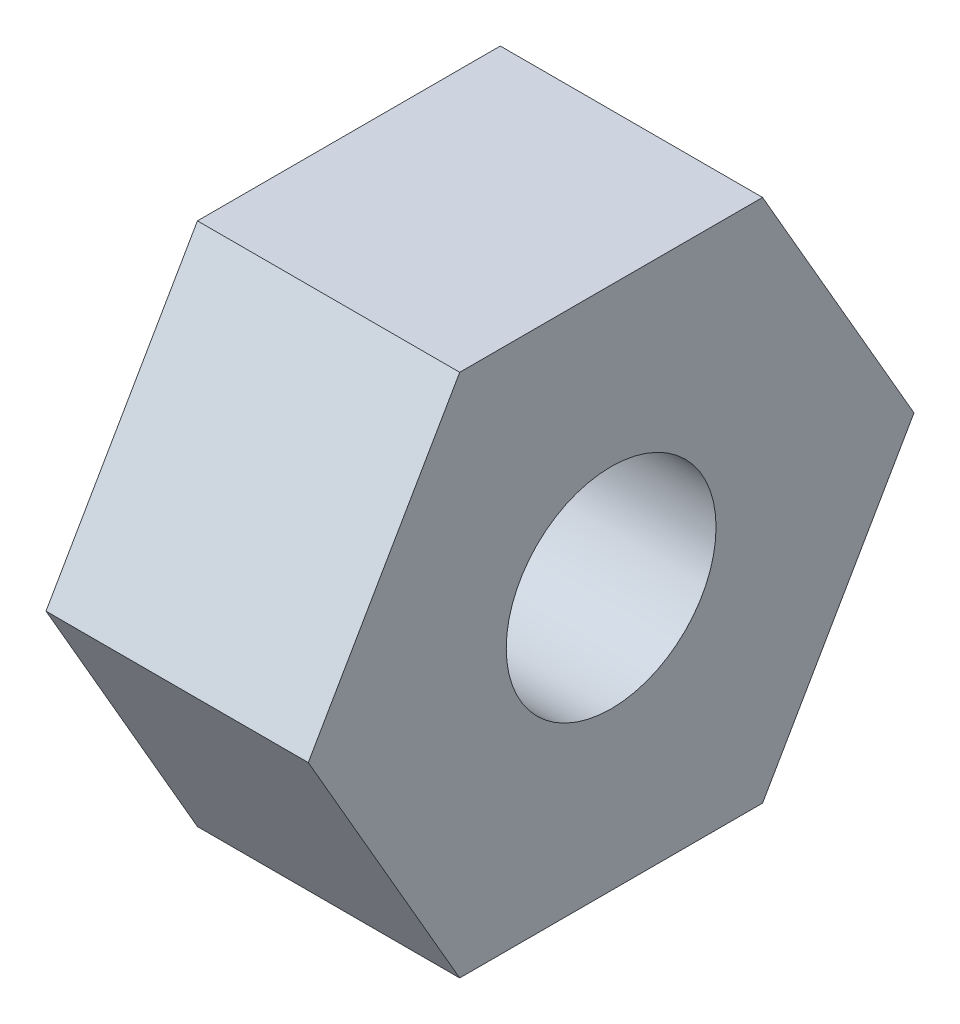
ISO-10303-21;
HEADER;
FILE_DESCRIPTION(('STEP AP214'),'2;1');
FILE_NAME('part.step','',(''),(''),'','','');
FILE_SCHEMA(('AUTOMOTIVE_DESIGN { 1 0 10303 214 1 1 1 1 }'));
ENDSEC;
DATA;
#1=APPLICATION_CONTEXT('core data for automotive mechanical design processes');
#2=APPLICATION_PROTOCOL_DEFINITION('international standard','automotive_design',2000,#1);
#3=PRODUCT_CONTEXT('',#1,'mechanical');
#4=PRODUCT('Part','Part','',(#3));
#5=PRODUCT_RELATED_PRODUCT_CATEGORY('part','',(#4));
#6=PRODUCT_DEFINITION_FORMATION('','',#4);
#7=PRODUCT_DEFINITION_CONTEXT('part definition',#1,'design');
#8=PRODUCT_DEFINITION('design','',#6,#7);
#9=PRODUCT_DEFINITION_SHAPE('','',#8);
#10=(LENGTH_UNIT() NAMED_UNIT(*) SI_UNIT(.MILLI.,.METRE.));
#11=(NAMED_UNIT(*) PLANE_ANGLE_UNIT() SI_UNIT($,.RADIAN.));
#12=(NAMED_UNIT(*) SI_UNIT($,.STERADIAN.) SOLID_ANGLE_UNIT());
#13=UNCERTAINTY_MEASURE_WITH_UNIT(LENGTH_MEASURE(1.E-05),#10,'distance_accuracy_value','');
#14=(GEOMETRIC_REPRESENTATION_CONTEXT(3) GLOBAL_UNCERTAINTY_ASSIGNED_CONTEXT((#13)) GLOBAL_UNIT_ASSIGNED_CONTEXT((#10,
#11,#12)) REPRESENTATION_CONTEXT('',''));
#15=CARTESIAN_POINT('',(0.,0.,0.));
#16=DIRECTION('',(0.,0.,1.));
#17=DIRECTION('',(1.,0.,0.));
#18=AXIS2_PLACEMENT_3D('',#15,#16,#17);
#19=CARTESIAN_POINT('',(5.,-4.99999999999995,-2.88675134594818));
#20=DIRECTION('',(0.,0.499999999999995,0.866025403784442));
#21=DIRECTION('',(0.,-0.866025403784442,0.499999999999995));
#22=AXIS2_PLACEMENT_3D('',#19,#20,#21);
#23=PLANE('',#22);
#24=DIRECTION('',(0.,0.866025403784442,-0.499999999999995));
#25=VECTOR('',#24,1.);
#26=CARTESIAN_POINT('',(0.,-4.99999999999995,-2.88675134594818));
#27=LINE('',#26,#25);
#28=CARTESIAN_POINT('',(0.,-4.99999999999995,-2.88675134594818));
#29=VERTEX_POINT('',#28);
#30=CARTESIAN_POINT('',(0.,0.,-5.77350269189624));
#31=VERTEX_POINT('',#30);
#32=EDGE_CURVE('E117',#29,#31,#27,.T.);
#33=ORIENTED_EDGE('',*,*,#32,.T.);
#34=DIRECTION('',(-1.,0.,0.));
#35=VECTOR('',#34,1.);
#36=CARTESIAN_POINT('',(5.,0.,-5.77350269189624));
#37=LINE('',#36,#35);
#38=CARTESIAN_POINT('',(5.,0.,-5.77350269189624));
#39=VERTEX_POINT('',#38);
#40=EDGE_CURVE('E11',#39,#31,#37,.T.);
#41=ORIENTED_EDGE('',*,*,#40,.F.);
#42=DIRECTION('',(0.,0.866025403784442,-0.499999999999995));
#43=VECTOR('',#42,1.);
#44=CARTESIAN_POINT('',(5.,-4.99999999999995,-2.88675134594818));
#45=LINE('',#44,#43);
#46=CARTESIAN_POINT('',(5.,-4.99999999999995,-2.88675134594818));
#47=VERTEX_POINT('',#46);
#48=EDGE_CURVE('E128',#47,#39,#45,.T.);
#49=ORIENTED_EDGE('',*,*,#48,.F.);
#50=DIRECTION('',(-1.,0.,0.));
#51=VECTOR('',#50,1.);
#52=CARTESIAN_POINT('',(5.,-4.99999999999995,-2.88675134594818));
#53=LINE('',#52,#51);
#54=EDGE_CURVE('E113',#47,#29,#53,.T.);
#55=ORIENTED_EDGE('',*,*,#54,.T.);
#56=EDGE_LOOP('',(#33,#41,#49,#55));
#57=FACE_BOUND('',#56,.T.);
#58=ADVANCED_FACE('F33',(#57),#23,.F.);
#59=CARTESIAN_POINT('',(5.,0.,-5.77350269189624));
#60=DIRECTION('',(0.,-0.500000000000001,0.866025403784438));
#61=DIRECTION('',(0.,-0.866025403784438,-0.500000000000001));
#62=AXIS2_PLACEMENT_3D('',#59,#60,#61);
#63=PLANE('',#62);
#64=DIRECTION('',(0.,0.866025403784438,0.500000000000001));
#65=VECTOR('',#64,1.);
#66=CARTESIAN_POINT('',(0.,0.,-5.77350269189624));
#67=LINE('',#66,#65);
#68=CARTESIAN_POINT('',(0.,4.99999999999999,-2.88675134594811));
#69=VERTEX_POINT('',#68);
#70=EDGE_CURVE('E120',#31,#69,#67,.T.);
#71=ORIENTED_EDGE('',*,*,#70,.T.);
#72=DIRECTION('',(-1.,0.,0.));
#73=VECTOR('',#72,1.);
#74=CARTESIAN_POINT('',(5.,4.99999999999999,-2.88675134594811));
#75=LINE('',#74,#73);
#76=CARTESIAN_POINT('',(5.,4.99999999999999,-2.88675134594811));
#77=VERTEX_POINT('',#76);
#78=EDGE_CURVE('E41',#77,#69,#75,.T.);
#79=ORIENTED_EDGE('',*,*,#78,.F.);
#80=DIRECTION('',(0.,0.866025403784438,0.500000000000001));
#81=VECTOR('',#80,1.);
#82=CARTESIAN_POINT('',(5.,0.,-5.77350269189624));
#83=LINE('',#82,#81);
#84=EDGE_CURVE('E86',#39,#77,#83,.T.);
#85=ORIENTED_EDGE('',*,*,#84,.F.);
#86=ORIENTED_EDGE('',*,*,#40,.T.);
#87=EDGE_LOOP('',(#71,#79,#85,#86));
#88=FACE_BOUND('',#87,.T.);
#89=ADVANCED_FACE('F153',(#88),#63,.F.);
#90=CARTESIAN_POINT('',(5.,4.99999999999999,-2.88675134594811));
#91=DIRECTION('',(0.,-1.,0.));
#92=DIRECTION('',(0.,0.,-1.));
#93=AXIS2_PLACEMENT_3D('',#90,#91,#92);
#94=PLANE('',#93);
#95=DIRECTION('',(0.,0.,1.));
#96=VECTOR('',#95,1.);
#97=CARTESIAN_POINT('',(0.,4.99999999999999,-2.88675134594811));
#98=LINE('',#97,#96);
#99=CARTESIAN_POINT('',(0.,4.99999999999997,2.88675134594814));
#100=VERTEX_POINT('',#99);
#101=EDGE_CURVE('E123',#69,#100,#98,.T.);
#102=ORIENTED_EDGE('',*,*,#101,.T.);
#103=DIRECTION('',(-1.,0.,0.));
#104=VECTOR('',#103,1.);
#105=CARTESIAN_POINT('',(5.,4.99999999999997,2.88675134594814));
#106=LINE('',#105,#104);
#107=CARTESIAN_POINT('',(5.,4.99999999999997,2.88675134594814));
#108=VERTEX_POINT('',#107);
#109=EDGE_CURVE('E108',#108,#100,#106,.T.);
#110=ORIENTED_EDGE('',*,*,#109,.F.);
#111=DIRECTION('',(0.,0.,1.));
#112=VECTOR('',#111,1.);
#113=CARTESIAN_POINT('',(5.,4.99999999999999,-2.88675134594811));
#114=LINE('',#113,#112);
#115=EDGE_CURVE('E99',#77,#108,#114,.T.);
#116=ORIENTED_EDGE('',*,*,#115,.F.);
#117=ORIENTED_EDGE('',*,*,#78,.T.);
#118=EDGE_LOOP('',(#102,#110,#116,#117));
#119=FACE_BOUND('',#118,.T.);
#120=ADVANCED_FACE('F134',(#119),#94,.F.);
#121=CARTESIAN_POINT('',(5.,4.99999999999997,2.88675134594814));
#122=DIRECTION('',(0.,-0.499999999999995,-0.866025403784442));
#123=DIRECTION('',(0.,0.866025403784442,-0.499999999999995));
#124=AXIS2_PLACEMENT_3D('',#121,#122,#123);
#125=PLANE('',#124);
#126=DIRECTION('',(0.,-0.866025403784442,0.499999999999995));
#127=VECTOR('',#126,1.);
#128=CARTESIAN_POINT('',(0.,4.99999999999997,2.88675134594814));
#129=LINE('',#128,#127);
#130=CARTESIAN_POINT('',(0.,0.,5.77350269189624));
#131=VERTEX_POINT('',#130);
#132=EDGE_CURVE('E107',#100,#131,#129,.T.);
#133=ORIENTED_EDGE('',*,*,#132,.T.);
#134=DIRECTION('',(-1.,0.,0.));
#135=VECTOR('',#134,1.);
#136=CARTESIAN_POINT('',(5.,0.,5.77350269189624));
#137=LINE('',#136,#135);
#138=CARTESIAN_POINT('',(5.,0.,5.77350269189624));
#139=VERTEX_POINT('',#138);
#140=EDGE_CURVE('E104',#139,#131,#137,.T.);
#141=ORIENTED_EDGE('',*,*,#140,.F.);
#142=DIRECTION('',(0.,-0.866025403784442,0.499999999999995));
#143=VECTOR('',#142,1.);
#144=CARTESIAN_POINT('',(5.,4.99999999999997,2.88675134594814));
#145=LINE('',#144,#143);
#146=EDGE_CURVE('E93',#108,#139,#145,.T.);
#147=ORIENTED_EDGE('',*,*,#146,.F.);
#148=ORIENTED_EDGE('',*,*,#109,.T.);
#149=EDGE_LOOP('',(#133,#141,#147,#148));
#150=FACE_BOUND('',#149,.T.);
#151=ADVANCED_FACE('F105',(#150),#125,.F.);
#152=CARTESIAN_POINT('',(5.,0.,5.77350269189624));
#153=DIRECTION('',(0.,0.500000000000007,-0.866025403784435));
#154=DIRECTION('',(0.,0.866025403784435,0.500000000000007));
#155=AXIS2_PLACEMENT_3D('',#152,#153,#154);
#156=PLANE('',#155);
#157=DIRECTION('',(0.,-0.866025403784434,-0.500000000000007));
#158=VECTOR('',#157,1.);
#159=CARTESIAN_POINT('',(0.,0.,5.77350269189624));
#160=LINE('',#159,#158);
#161=CARTESIAN_POINT('',(0.,-5.00000000000001,2.88675134594807));
#162=VERTEX_POINT('',#161);
#163=EDGE_CURVE('E72',#131,#162,#160,.T.);
#164=ORIENTED_EDGE('',*,*,#163,.T.);
#165=DIRECTION('',(-1.,0.,0.));
#166=VECTOR('',#165,1.);
#167=CARTESIAN_POINT('',(5.,-5.00000000000001,2.88675134594807));
#168=LINE('',#167,#166);
#169=CARTESIAN_POINT('',(5.,-5.00000000000001,2.88675134594807));
#170=VERTEX_POINT('',#169);
#171=EDGE_CURVE('E109',#170,#162,#168,.T.);
#172=ORIENTED_EDGE('',*,*,#171,.F.);
#173=DIRECTION('',(0.,-0.866025403784434,-0.500000000000007));
#174=VECTOR('',#173,1.);
#175=CARTESIAN_POINT('',(5.,0.,5.77350269189624));
#176=LINE('',#175,#174);
#177=EDGE_CURVE('E97',#139,#170,#176,.T.);
#178=ORIENTED_EDGE('',*,*,#177,.F.);
#179=ORIENTED_EDGE('',*,*,#140,.T.);
#180=EDGE_LOOP('',(#164,#172,#178,#179));
#181=FACE_BOUND('',#180,.T.);
#182=ADVANCED_FACE('F111',(#181),#156,.F.);
#183=CARTESIAN_POINT('',(5.,-5.00000000000001,2.88675134594807));
#184=DIRECTION('',(0.,1.,0.));
#185=DIRECTION('',(0.,0.,1.));
#186=AXIS2_PLACEMENT_3D('',#183,#184,#185);
#187=PLANE('',#186);
#188=DIRECTION('',(0.,0.,-1.));
#189=VECTOR('',#188,1.);
#190=CARTESIAN_POINT('',(0.,-5.00000000000001,2.88675134594807));
#191=LINE('',#190,#189);
#192=EDGE_CURVE('E78',#162,#29,#191,.T.);
#193=ORIENTED_EDGE('',*,*,#192,.T.);
#194=ORIENTED_EDGE('',*,*,#54,.F.);
#195=DIRECTION('',(0.,0.,-1.));
#196=VECTOR('',#195,1.);
#197=CARTESIAN_POINT('',(5.,-5.00000000000001,2.88675134594807));
#198=LINE('',#197,#196);
#199=EDGE_CURVE('E49',#170,#47,#198,.T.);
#200=ORIENTED_EDGE('',*,*,#199,.F.);
#201=ORIENTED_EDGE('',*,*,#171,.T.);
#202=EDGE_LOOP('',(#193,#194,#200,#201));
#203=FACE_BOUND('',#202,.T.);
#204=ADVANCED_FACE('F141',(#203),#187,.F.);
#205=CARTESIAN_POINT('',(5.,0.,0.));
#206=DIRECTION('',(1.,0.,0.));
#207=DIRECTION('',(0.,0.,-1.));
#208=AXIS2_PLACEMENT_3D('',#205,#206,#207);
#209=PLANE('',#208);
#210=CARTESIAN_POINT('',(5.,0.,0.));
#211=DIRECTION('',(-1.,0.,0.));
#212=DIRECTION('',(0.,0.,1.));
#213=AXIS2_PLACEMENT_3D('',#210,#211,#212);
#214=CIRCLE('',#213,2.);
#215=CARTESIAN_POINT('',(5.,0.,2.));
#216=VERTEX_POINT('',#215);
#217=EDGE_CURVE('E121',#216,#216,#214,.T.);
#218=ORIENTED_EDGE('',*,*,#217,.T.);
#219=EDGE_LOOP('',(#218));
#220=FACE_BOUND('',#219,.T.);
#221=ORIENTED_EDGE('',*,*,#48,.T.);
#222=ORIENTED_EDGE('',*,*,#84,.T.);
#223=ORIENTED_EDGE('',*,*,#115,.T.);
#224=ORIENTED_EDGE('',*,*,#146,.T.);
#225=ORIENTED_EDGE('',*,*,#177,.T.);
#226=ORIENTED_EDGE('',*,*,#199,.T.);
#227=EDGE_LOOP('',(#221,#222,#223,#224,#225,#226));
#228=FACE_BOUND('',#227,.T.);
#229=ADVANCED_FACE('F95',(#220,#228),#209,.T.);
#230=CARTESIAN_POINT('',(0.,0.,0.));
#231=DIRECTION('',(1.,0.,0.));
#232=DIRECTION('',(0.,0.,-1.));
#233=AXIS2_PLACEMENT_3D('',#230,#231,#232);
#234=PLANE('',#233);
#235=CARTESIAN_POINT('',(0.,0.,0.));
#236=DIRECTION('',(-1.,0.,0.));
#237=DIRECTION('',(0.,0.,1.));
#238=AXIS2_PLACEMENT_3D('',#235,#236,#237);
#239=CIRCLE('',#238,2.);
#240=CARTESIAN_POINT('',(0.,0.,2.));
#241=VERTEX_POINT('',#240);
#242=EDGE_CURVE('E208',#241,#241,#239,.T.);
#243=ORIENTED_EDGE('',*,*,#242,.F.);
#244=EDGE_LOOP('',(#243));
#245=FACE_BOUND('',#244,.T.);
#246=ORIENTED_EDGE('',*,*,#32,.F.);
#247=ORIENTED_EDGE('',*,*,#192,.F.);
#248=ORIENTED_EDGE('',*,*,#163,.F.);
#249=ORIENTED_EDGE('',*,*,#132,.F.);
#250=ORIENTED_EDGE('',*,*,#101,.F.);
#251=ORIENTED_EDGE('',*,*,#70,.F.);
#252=EDGE_LOOP('',(#246,#247,#248,#249,#250,#251));
#253=FACE_BOUND('',#252,.T.);
#254=ADVANCED_FACE('F137',(#245,#253),#234,.F.);
#255=CARTESIAN_POINT('',(5.,0.,0.));
#256=DIRECTION('',(-1.,0.,0.));
#257=DIRECTION('',(0.,0.,1.));
#258=AXIS2_PLACEMENT_3D('',#255,#256,#257);
#259=CYLINDRICAL_SURFACE('',#258,2.);
#260=ORIENTED_EDGE('',*,*,#217,.F.);
#261=EDGE_LOOP('',(#260));
#262=FACE_BOUND('',#261,.T.);
#263=ORIENTED_EDGE('',*,*,#242,.T.);
#264=EDGE_LOOP('',(#263));
#265=FACE_BOUND('',#264,.T.);
#266=ADVANCED_FACE('F190',(#262,#265),#259,.F.);
#267=CLOSED_SHELL('',(#58,#89,#120,#151,#182,#204,#229,#254,#266));
#268=MANIFOLD_SOLID_BREP('B2',#267);
#269=ADVANCED_BREP_SHAPE_REPRESENTATION('',(#18,#268),#14);
#270=SHAPE_DEFINITION_REPRESENTATION(#9,#269);
ENDSEC;
END-ISO-10303-21;
